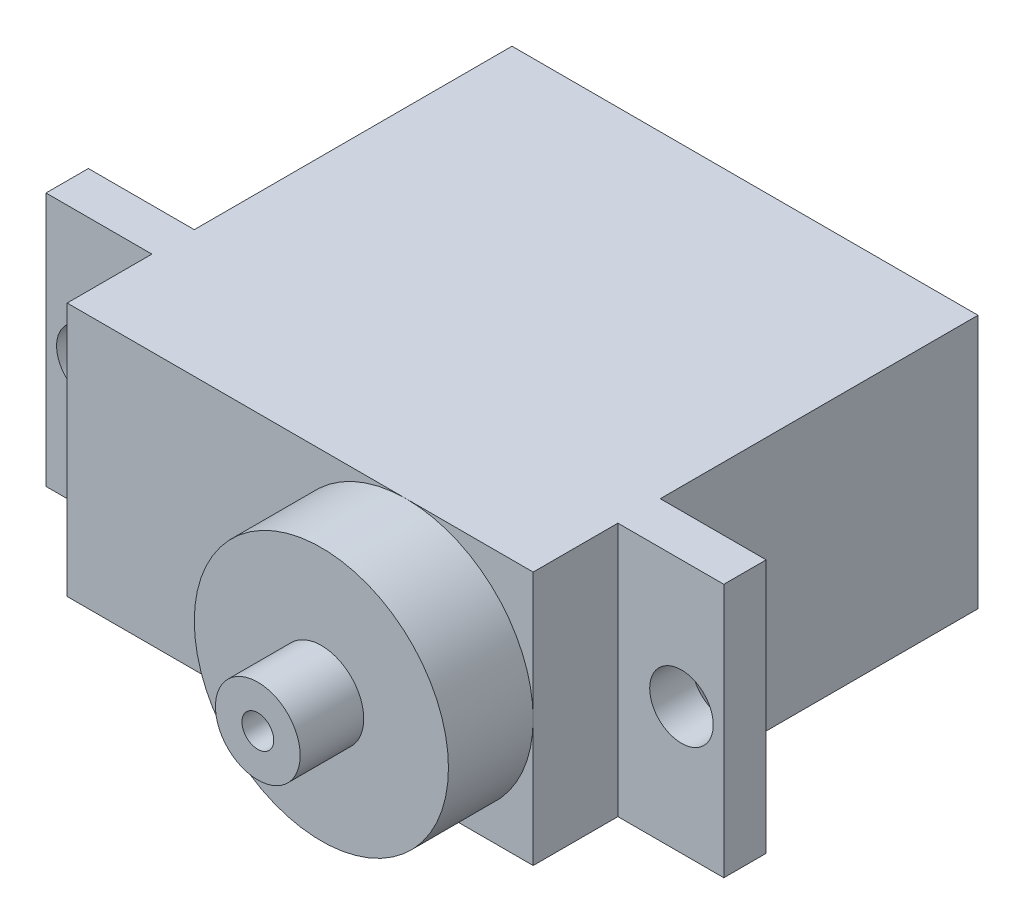
ISO-10303-21;
HEADER;
FILE_DESCRIPTION(('STEP AP214'),'2;1');
FILE_NAME('part.step','',(''),(''),'','','');
FILE_SCHEMA(('AUTOMOTIVE_DESIGN { 1 0 10303 214 1 1 1 1 }'));
ENDSEC;
DATA;
#1=APPLICATION_CONTEXT('core data for automotive mechanical design processes');
#2=APPLICATION_PROTOCOL_DEFINITION('international standard','automotive_design',2000,#1);
#3=PRODUCT_CONTEXT('',#1,'mechanical');
#4=PRODUCT('Part','Part','',(#3));
#5=PRODUCT_RELATED_PRODUCT_CATEGORY('part','',(#4));
#6=PRODUCT_DEFINITION_FORMATION('','',#4);
#7=PRODUCT_DEFINITION_CONTEXT('part definition',#1,'design');
#8=PRODUCT_DEFINITION('design','',#6,#7);
#9=PRODUCT_DEFINITION_SHAPE('','',#8);
#10=(LENGTH_UNIT() NAMED_UNIT(*) SI_UNIT(.MILLI.,.METRE.));
#11=(NAMED_UNIT(*) PLANE_ANGLE_UNIT() SI_UNIT($,.RADIAN.));
#12=(NAMED_UNIT(*) SI_UNIT($,.STERADIAN.) SOLID_ANGLE_UNIT());
#13=UNCERTAINTY_MEASURE_WITH_UNIT(LENGTH_MEASURE(1.E-05),#10,'distance_accuracy_value','');
#14=(GEOMETRIC_REPRESENTATION_CONTEXT(3) GLOBAL_UNCERTAINTY_ASSIGNED_CONTEXT((#13)) GLOBAL_UNIT_ASSIGNED_CONTEXT((#10,
#11,#12)) REPRESENTATION_CONTEXT('',''));
#15=CARTESIAN_POINT('',(0.,0.,0.));
#16=DIRECTION('',(0.,0.,1.));
#17=DIRECTION('',(1.,0.,0.));
#18=AXIS2_PLACEMENT_3D('',#15,#16,#17);
#19=CARTESIAN_POINT('',(0.,0.,21.));
#20=DIRECTION('',(0.,0.,1.));
#21=DIRECTION('',(1.,0.,0.));
#22=AXIS2_PLACEMENT_3D('',#19,#20,#21);
#23=PLANE('',#22);
#24=CARTESIAN_POINT('',(4.99999999999999,0.,21.));
#25=DIRECTION('',(0.,0.,1.));
#26=DIRECTION('',(1.,0.,0.));
#27=AXIS2_PLACEMENT_3D('',#24,#25,#26);
#28=CIRCLE('',#27,6.);
#29=CARTESIAN_POINT('',(11.,0.,21.));
#30=VERTEX_POINT('',#29);
#31=CARTESIAN_POINT('',(4.99999999999999,6.,21.));
#32=VERTEX_POINT('',#31);
#33=EDGE_CURVE('E46',#30,#32,#28,.T.);
#34=ORIENTED_EDGE('',*,*,#33,.F.);
#35=DIRECTION('',(0.,1.,0.));
#36=VECTOR('',#35,1.);
#37=CARTESIAN_POINT('',(11.,6.,21.));
#38=LINE('',#37,#36);
#39=CARTESIAN_POINT('',(11.,6.,21.));
#40=VERTEX_POINT('',#39);
#41=EDGE_CURVE('E140',#30,#40,#38,.T.);
#42=ORIENTED_EDGE('',*,*,#41,.T.);
#43=DIRECTION('',(-1.,0.,0.));
#44=VECTOR('',#43,1.);
#45=CARTESIAN_POINT('',(-11.,6.,21.));
#46=LINE('',#45,#44);
#47=EDGE_CURVE('E153',#40,#32,#46,.T.);
#48=ORIENTED_EDGE('',*,*,#47,.T.);
#49=EDGE_LOOP('',(#34,#42,#48));
#50=FACE_BOUND('',#49,.T.);
#51=ADVANCED_FACE('F35',(#50),#23,.T.);
#52=CARTESIAN_POINT('',(4.99999999999999,-6.,21.));
#53=VERTEX_POINT('',#52);
#54=EDGE_CURVE('E11',#32,#53,#28,.T.);
#55=ORIENTED_EDGE('',*,*,#54,.F.);
#56=CARTESIAN_POINT('',(-11.,6.,21.));
#57=VERTEX_POINT('',#56);
#58=EDGE_CURVE('E139',#32,#57,#46,.T.);
#59=ORIENTED_EDGE('',*,*,#58,.T.);
#60=DIRECTION('',(0.,-1.,0.));
#61=VECTOR('',#60,1.);
#62=CARTESIAN_POINT('',(-11.,6.,21.));
#63=LINE('',#62,#61);
#64=CARTESIAN_POINT('',(-11.,-6.,21.));
#65=VERTEX_POINT('',#64);
#66=EDGE_CURVE('E163',#57,#65,#63,.T.);
#67=ORIENTED_EDGE('',*,*,#66,.T.);
#68=DIRECTION('',(1.,0.,0.));
#69=VECTOR('',#68,1.);
#70=CARTESIAN_POINT('',(-11.,-6.,21.));
#71=LINE('',#70,#69);
#72=EDGE_CURVE('E151',#65,#53,#71,.T.);
#73=ORIENTED_EDGE('',*,*,#72,.T.);
#74=EDGE_LOOP('',(#55,#59,#67,#73));
#75=FACE_BOUND('',#74,.T.);
#76=ADVANCED_FACE('F283',(#75),#23,.T.);
#77=CARTESIAN_POINT('',(0.,0.,17.));
#78=DIRECTION('',(0.,0.,1.));
#79=DIRECTION('',(1.,0.,0.));
#80=AXIS2_PLACEMENT_3D('',#77,#78,#79);
#81=PLANE('',#80);
#82=CARTESIAN_POINT('',(-14.,0.,17.));
#83=DIRECTION('',(0.,0.,1.));
#84=DIRECTION('',(1.,0.,0.));
#85=AXIS2_PLACEMENT_3D('',#82,#83,#84);
#86=CIRCLE('',#85,1.5);
#87=CARTESIAN_POINT('',(-12.5,0.,17.));
#88=VERTEX_POINT('',#87);
#89=EDGE_CURVE('E535',#88,#88,#86,.T.);
#90=ORIENTED_EDGE('',*,*,#89,.F.);
#91=EDGE_LOOP('',(#90));
#92=FACE_BOUND('',#91,.T.);
#93=DIRECTION('',(0.,-1.,0.));
#94=VECTOR('',#93,1.);
#95=CARTESIAN_POINT('',(-11.,6.,17.));
#96=LINE('',#95,#94);
#97=CARTESIAN_POINT('',(-11.,6.,17.));
#98=VERTEX_POINT('',#97);
#99=CARTESIAN_POINT('',(-11.,-6.,17.));
#100=VERTEX_POINT('',#99);
#101=EDGE_CURVE('E170',#98,#100,#96,.T.);
#102=ORIENTED_EDGE('',*,*,#101,.F.);
#103=DIRECTION('',(-1.,0.,0.));
#104=VECTOR('',#103,1.);
#105=CARTESIAN_POINT('',(-16.,6.,17.));
#106=LINE('',#105,#104);
#107=CARTESIAN_POINT('',(-16.,6.,17.));
#108=VERTEX_POINT('',#107);
#109=EDGE_CURVE('E189',#98,#108,#106,.T.);
#110=ORIENTED_EDGE('',*,*,#109,.T.);
#111=DIRECTION('',(0.,-1.,0.));
#112=VECTOR('',#111,1.);
#113=CARTESIAN_POINT('',(-16.,6.,17.));
#114=LINE('',#113,#112);
#115=CARTESIAN_POINT('',(-16.,-6.,17.));
#116=VERTEX_POINT('',#115);
#117=EDGE_CURVE('E182',#108,#116,#114,.T.);
#118=ORIENTED_EDGE('',*,*,#117,.T.);
#119=DIRECTION('',(1.,0.,0.));
#120=VECTOR('',#119,1.);
#121=CARTESIAN_POINT('',(-16.,-6.,17.));
#122=LINE('',#121,#120);
#123=EDGE_CURVE('E185',#116,#100,#122,.T.);
#124=ORIENTED_EDGE('',*,*,#123,.T.);
#125=EDGE_LOOP('',(#102,#110,#118,#124));
#126=FACE_BOUND('',#125,.T.);
#127=ADVANCED_FACE('F288',(#92,#126),#81,.T.);
#128=CARTESIAN_POINT('',(16.,6.,30.));
#129=DIRECTION('',(-1.,0.,0.));
#130=DIRECTION('',(0.,-1.,0.));
#131=AXIS2_PLACEMENT_3D('',#128,#129,#130);
#132=PLANE('',#131);
#133=DIRECTION('',(0.,1.,0.));
#134=VECTOR('',#133,1.);
#135=CARTESIAN_POINT('',(16.,6.,17.));
#136=LINE('',#135,#134);
#137=CARTESIAN_POINT('',(16.,-6.,17.));
#138=VERTEX_POINT('',#137);
#139=CARTESIAN_POINT('',(16.,6.,17.));
#140=VERTEX_POINT('',#139);
#141=EDGE_CURVE('E187',#138,#140,#136,.T.);
#142=ORIENTED_EDGE('',*,*,#141,.F.);
#143=DIRECTION('',(0.,0.,-1.));
#144=VECTOR('',#143,1.);
#145=CARTESIAN_POINT('',(16.,-6.,30.));
#146=LINE('',#145,#144);
#147=CARTESIAN_POINT('',(16.,-6.,15.));
#148=VERTEX_POINT('',#147);
#149=EDGE_CURVE('E236',#138,#148,#146,.T.);
#150=ORIENTED_EDGE('',*,*,#149,.T.);
#151=DIRECTION('',(0.,-1.,0.));
#152=VECTOR('',#151,1.);
#153=CARTESIAN_POINT('',(16.,6.,15.));
#154=LINE('',#153,#152);
#155=CARTESIAN_POINT('',(16.,6.,15.));
#156=VERTEX_POINT('',#155);
#157=EDGE_CURVE('E212',#156,#148,#154,.T.);
#158=ORIENTED_EDGE('',*,*,#157,.F.);
#159=DIRECTION('',(0.,0.,-1.));
#160=VECTOR('',#159,1.);
#161=CARTESIAN_POINT('',(16.,6.,30.));
#162=LINE('',#161,#160);
#163=EDGE_CURVE('E158',#140,#156,#162,.T.);
#164=ORIENTED_EDGE('',*,*,#163,.F.);
#165=EDGE_LOOP('',(#142,#150,#158,#164));
#166=FACE_BOUND('',#165,.T.);
#167=ADVANCED_FACE('F37',(#166),#132,.F.);
#168=CARTESIAN_POINT('',(-16.,6.,30.));
#169=DIRECTION('',(0.,-1.,0.));
#170=DIRECTION('',(0.,0.,-1.));
#171=AXIS2_PLACEMENT_3D('',#168,#169,#170);
#172=PLANE('',#171);
#173=CARTESIAN_POINT('',(11.,6.,17.));
#174=VERTEX_POINT('',#173);
#175=EDGE_CURVE('E190',#140,#174,#106,.T.);
#176=ORIENTED_EDGE('',*,*,#175,.F.);
#177=ORIENTED_EDGE('',*,*,#163,.T.);
#178=DIRECTION('',(1.,0.,0.));
#179=VECTOR('',#178,1.);
#180=CARTESIAN_POINT('',(16.,6.,15.));
#181=LINE('',#180,#179);
#182=CARTESIAN_POINT('',(11.,6.,15.));
#183=VERTEX_POINT('',#182);
#184=EDGE_CURVE('E221',#183,#156,#181,.T.);
#185=ORIENTED_EDGE('',*,*,#184,.F.);
#186=DIRECTION('',(0.,0.,-1.));
#187=VECTOR('',#186,1.);
#188=CARTESIAN_POINT('',(11.,6.,15.));
#189=LINE('',#188,#187);
#190=CARTESIAN_POINT('',(11.,6.,0.));
#191=VERTEX_POINT('',#190);
#192=EDGE_CURVE('E226',#183,#191,#189,.T.);
#193=ORIENTED_EDGE('',*,*,#192,.T.);
#194=DIRECTION('',(-1.,0.,0.));
#195=VECTOR('',#194,1.);
#196=CARTESIAN_POINT('',(-16.,6.,0.));
#197=LINE('',#196,#195);
#198=CARTESIAN_POINT('',(-11.,6.,0.));
#199=VERTEX_POINT('',#198);
#200=EDGE_CURVE('E229',#191,#199,#197,.T.);
#201=ORIENTED_EDGE('',*,*,#200,.T.);
#202=DIRECTION('',(0.,0.,-1.));
#203=VECTOR('',#202,1.);
#204=CARTESIAN_POINT('',(-11.,6.,15.));
#205=LINE('',#204,#203);
#206=CARTESIAN_POINT('',(-11.,6.,15.));
#207=VERTEX_POINT('',#206);
#208=EDGE_CURVE('E205',#207,#199,#205,.T.);
#209=ORIENTED_EDGE('',*,*,#208,.F.);
#210=DIRECTION('',(1.,0.,0.));
#211=VECTOR('',#210,1.);
#212=CARTESIAN_POINT('',(-16.,6.,15.));
#213=LINE('',#212,#211);
#214=CARTESIAN_POINT('',(-16.,6.,15.));
#215=VERTEX_POINT('',#214);
#216=EDGE_CURVE('E196',#215,#207,#213,.T.);
#217=ORIENTED_EDGE('',*,*,#216,.F.);
#218=DIRECTION('',(0.,0.,-1.));
#219=VECTOR('',#218,1.);
#220=CARTESIAN_POINT('',(-16.,6.,30.));
#221=LINE('',#220,#219);
#222=EDGE_CURVE('E159',#108,#215,#221,.T.);
#223=ORIENTED_EDGE('',*,*,#222,.F.);
#224=ORIENTED_EDGE('',*,*,#109,.F.);
#225=DIRECTION('',(0.,0.,-1.));
#226=VECTOR('',#225,1.);
#227=CARTESIAN_POINT('',(-11.,6.,21.));
#228=LINE('',#227,#226);
#229=EDGE_CURVE('E169',#57,#98,#228,.T.);
#230=ORIENTED_EDGE('',*,*,#229,.F.);
#231=ORIENTED_EDGE('',*,*,#58,.F.);
#232=ORIENTED_EDGE('',*,*,#47,.F.);
#233=DIRECTION('',(0.,0.,-1.));
#234=VECTOR('',#233,1.);
#235=CARTESIAN_POINT('',(11.,6.,21.));
#236=LINE('',#235,#234);
#237=EDGE_CURVE('E147',#40,#174,#236,.T.);
#238=ORIENTED_EDGE('',*,*,#237,.T.);
#239=EDGE_LOOP('',(#176,#177,#185,#193,#201,#209,#217,#223,#224,#230,#231,#232,#238));
#240=FACE_BOUND('',#239,.T.);
#241=ADVANCED_FACE('F254',(#240),#172,.F.);
#242=CARTESIAN_POINT('',(-16.,6.,30.));
#243=DIRECTION('',(1.,0.,0.));
#244=DIRECTION('',(0.,1.,0.));
#245=AXIS2_PLACEMENT_3D('',#242,#243,#244);
#246=PLANE('',#245);
#247=ORIENTED_EDGE('',*,*,#117,.F.);
#248=ORIENTED_EDGE('',*,*,#222,.T.);
#249=DIRECTION('',(0.,1.,0.));
#250=VECTOR('',#249,1.);
#251=CARTESIAN_POINT('',(-16.,6.,15.));
#252=LINE('',#251,#250);
#253=CARTESIAN_POINT('',(-16.,-6.,15.));
#254=VERTEX_POINT('',#253);
#255=EDGE_CURVE('E193',#254,#215,#252,.T.);
#256=ORIENTED_EDGE('',*,*,#255,.F.);
#257=DIRECTION('',(0.,0.,-1.));
#258=VECTOR('',#257,1.);
#259=CARTESIAN_POINT('',(-16.,-6.,30.));
#260=LINE('',#259,#258);
#261=EDGE_CURVE('E238',#116,#254,#260,.T.);
#262=ORIENTED_EDGE('',*,*,#261,.F.);
#263=EDGE_LOOP('',(#247,#248,#256,#262));
#264=FACE_BOUND('',#263,.T.);
#265=ADVANCED_FACE('F244',(#264),#246,.F.);
#266=CARTESIAN_POINT('',(-16.,-6.,30.));
#267=DIRECTION('',(0.,1.,0.));
#268=DIRECTION('',(0.,0.,1.));
#269=AXIS2_PLACEMENT_3D('',#266,#267,#268);
#270=PLANE('',#269);
#271=ORIENTED_EDGE('',*,*,#123,.F.);
#272=ORIENTED_EDGE('',*,*,#261,.T.);
#273=DIRECTION('',(-1.,0.,0.));
#274=VECTOR('',#273,1.);
#275=CARTESIAN_POINT('',(-16.,-6.,15.));
#276=LINE('',#275,#274);
#277=CARTESIAN_POINT('',(-11.,-6.,15.));
#278=VERTEX_POINT('',#277);
#279=EDGE_CURVE('E202',#278,#254,#276,.T.);
#280=ORIENTED_EDGE('',*,*,#279,.F.);
#281=DIRECTION('',(0.,0.,-1.));
#282=VECTOR('',#281,1.);
#283=CARTESIAN_POINT('',(-11.,-6.,15.));
#284=LINE('',#283,#282);
#285=CARTESIAN_POINT('',(-11.,-6.,0.));
#286=VERTEX_POINT('',#285);
#287=EDGE_CURVE('E207',#278,#286,#284,.T.);
#288=ORIENTED_EDGE('',*,*,#287,.T.);
#289=DIRECTION('',(1.,0.,0.));
#290=VECTOR('',#289,1.);
#291=CARTESIAN_POINT('',(-16.,-6.,0.));
#292=LINE('',#291,#290);
#293=CARTESIAN_POINT('',(11.,-6.,0.));
#294=VERTEX_POINT('',#293);
#295=EDGE_CURVE('E234',#286,#294,#292,.T.);
#296=ORIENTED_EDGE('',*,*,#295,.T.);
#297=DIRECTION('',(0.,0.,-1.));
#298=VECTOR('',#297,1.);
#299=CARTESIAN_POINT('',(11.,-6.,15.));
#300=LINE('',#299,#298);
#301=CARTESIAN_POINT('',(11.,-6.,15.));
#302=VERTEX_POINT('',#301);
#303=EDGE_CURVE('E224',#302,#294,#300,.T.);
#304=ORIENTED_EDGE('',*,*,#303,.F.);
#305=DIRECTION('',(-1.,0.,0.));
#306=VECTOR('',#305,1.);
#307=CARTESIAN_POINT('',(16.,-6.,15.));
#308=LINE('',#307,#306);
#309=EDGE_CURVE('E215',#148,#302,#308,.T.);
#310=ORIENTED_EDGE('',*,*,#309,.F.);
#311=ORIENTED_EDGE('',*,*,#149,.F.);
#312=CARTESIAN_POINT('',(11.,-6.,17.));
#313=VERTEX_POINT('',#312);
#314=EDGE_CURVE('E184',#313,#138,#122,.T.);
#315=ORIENTED_EDGE('',*,*,#314,.F.);
#316=DIRECTION('',(0.,0.,-1.));
#317=VECTOR('',#316,1.);
#318=CARTESIAN_POINT('',(11.,-6.,21.));
#319=LINE('',#318,#317);
#320=CARTESIAN_POINT('',(11.,-6.,21.));
#321=VERTEX_POINT('',#320);
#322=EDGE_CURVE('E177',#321,#313,#319,.T.);
#323=ORIENTED_EDGE('',*,*,#322,.F.);
#324=EDGE_CURVE('E135',#53,#321,#71,.T.);
#325=ORIENTED_EDGE('',*,*,#324,.F.);
#326=ORIENTED_EDGE('',*,*,#72,.F.);
#327=DIRECTION('',(0.,0.,-1.));
#328=VECTOR('',#327,1.);
#329=CARTESIAN_POINT('',(-11.,-6.,21.));
#330=LINE('',#329,#328);
#331=EDGE_CURVE('E179',#65,#100,#330,.T.);
#332=ORIENTED_EDGE('',*,*,#331,.T.);
#333=EDGE_LOOP('',(#271,#272,#280,#288,#296,#304,#310,#311,#315,#323,#325,#326,#332));
#334=FACE_BOUND('',#333,.T.);
#335=ADVANCED_FACE('F266',(#334),#270,.F.);
#336=CARTESIAN_POINT('',(0.,0.,0.));
#337=DIRECTION('',(0.,0.,1.));
#338=DIRECTION('',(1.,0.,0.));
#339=AXIS2_PLACEMENT_3D('',#336,#337,#338);
#340=PLANE('',#339);
#341=ORIENTED_EDGE('',*,*,#295,.F.);
#342=DIRECTION('',(0.,-1.,0.));
#343=VECTOR('',#342,1.);
#344=CARTESIAN_POINT('',(-11.,6.,0.));
#345=LINE('',#344,#343);
#346=EDGE_CURVE('E192',#199,#286,#345,.T.);
#347=ORIENTED_EDGE('',*,*,#346,.F.);
#348=ORIENTED_EDGE('',*,*,#200,.F.);
#349=DIRECTION('',(0.,1.,0.));
#350=VECTOR('',#349,1.);
#351=CARTESIAN_POINT('',(11.,6.,0.));
#352=LINE('',#351,#350);
#353=EDGE_CURVE('E210',#294,#191,#352,.T.);
#354=ORIENTED_EDGE('',*,*,#353,.F.);
#355=EDGE_LOOP('',(#341,#347,#348,#354));
#356=FACE_BOUND('',#355,.T.);
#357=ADVANCED_FACE('F261',(#356),#340,.F.);
#358=CARTESIAN_POINT('',(11.,6.,15.));
#359=DIRECTION('',(-1.,0.,0.));
#360=DIRECTION('',(0.,0.,1.));
#361=AXIS2_PLACEMENT_3D('',#358,#359,#360);
#362=PLANE('',#361);
#363=ORIENTED_EDGE('',*,*,#353,.T.);
#364=ORIENTED_EDGE('',*,*,#192,.F.);
#365=DIRECTION('',(0.,1.,0.));
#366=VECTOR('',#365,1.);
#367=CARTESIAN_POINT('',(11.,6.,15.));
#368=LINE('',#367,#366);
#369=EDGE_CURVE('E218',#302,#183,#368,.T.);
#370=ORIENTED_EDGE('',*,*,#369,.F.);
#371=ORIENTED_EDGE('',*,*,#303,.T.);
#372=EDGE_LOOP('',(#363,#364,#370,#371));
#373=FACE_BOUND('',#372,.T.);
#374=ADVANCED_FACE('F269',(#373),#362,.F.);
#375=CARTESIAN_POINT('',(0.,0.,15.));
#376=DIRECTION('',(0.,0.,-1.));
#377=DIRECTION('',(-1.,0.,0.));
#378=AXIS2_PLACEMENT_3D('',#375,#376,#377);
#379=PLANE('',#378);
#380=CARTESIAN_POINT('',(14.,0.,15.));
#381=DIRECTION('',(0.,0.,-1.));
#382=DIRECTION('',(-1.,0.,0.));
#383=AXIS2_PLACEMENT_3D('',#380,#381,#382);
#384=CIRCLE('',#383,1.5);
#385=CARTESIAN_POINT('',(12.5,0.,15.));
#386=VERTEX_POINT('',#385);
#387=EDGE_CURVE('E530',#386,#386,#384,.F.);
#388=ORIENTED_EDGE('',*,*,#387,.T.);
#389=EDGE_LOOP('',(#388));
#390=FACE_BOUND('',#389,.T.);
#391=ORIENTED_EDGE('',*,*,#157,.T.);
#392=ORIENTED_EDGE('',*,*,#309,.T.);
#393=ORIENTED_EDGE('',*,*,#369,.T.);
#394=ORIENTED_EDGE('',*,*,#184,.T.);
#395=EDGE_LOOP('',(#391,#392,#393,#394));
#396=FACE_BOUND('',#395,.T.);
#397=ADVANCED_FACE('F272',(#390,#396),#379,.T.);
#398=CARTESIAN_POINT('',(-11.,6.,15.));
#399=DIRECTION('',(1.,0.,0.));
#400=DIRECTION('',(0.,1.,0.));
#401=AXIS2_PLACEMENT_3D('',#398,#399,#400);
#402=PLANE('',#401);
#403=ORIENTED_EDGE('',*,*,#346,.T.);
#404=ORIENTED_EDGE('',*,*,#287,.F.);
#405=DIRECTION('',(0.,-1.,0.));
#406=VECTOR('',#405,1.);
#407=CARTESIAN_POINT('',(-11.,6.,15.));
#408=LINE('',#407,#406);
#409=EDGE_CURVE('E199',#207,#278,#408,.T.);
#410=ORIENTED_EDGE('',*,*,#409,.F.);
#411=ORIENTED_EDGE('',*,*,#208,.T.);
#412=EDGE_LOOP('',(#403,#404,#410,#411));
#413=FACE_BOUND('',#412,.T.);
#414=ADVANCED_FACE('F258',(#413),#402,.F.);
#415=CARTESIAN_POINT('',(0.,0.,15.));
#416=DIRECTION('',(0.,0.,1.));
#417=DIRECTION('',(1.,0.,0.));
#418=AXIS2_PLACEMENT_3D('',#415,#416,#417);
#419=PLANE('',#418);
#420=CARTESIAN_POINT('',(-14.,0.,15.));
#421=DIRECTION('',(0.,0.,1.));
#422=DIRECTION('',(1.,0.,0.));
#423=AXIS2_PLACEMENT_3D('',#420,#421,#422);
#424=CIRCLE('',#423,1.5);
#425=CARTESIAN_POINT('',(-12.5,0.,15.));
#426=VERTEX_POINT('',#425);
#427=EDGE_CURVE('E39',#426,#426,#424,.T.);
#428=ORIENTED_EDGE('',*,*,#427,.T.);
#429=EDGE_LOOP('',(#428));
#430=FACE_BOUND('',#429,.T.);
#431=ORIENTED_EDGE('',*,*,#255,.T.);
#432=ORIENTED_EDGE('',*,*,#216,.T.);
#433=ORIENTED_EDGE('',*,*,#409,.T.);
#434=ORIENTED_EDGE('',*,*,#279,.T.);
#435=EDGE_LOOP('',(#431,#432,#433,#434));
#436=FACE_BOUND('',#435,.T.);
#437=ADVANCED_FACE('F250',(#430,#436),#419,.F.);
#438=CARTESIAN_POINT('',(14.,0.,17.));
#439=DIRECTION('',(0.,0.,-1.));
#440=DIRECTION('',(-1.,0.,0.));
#441=AXIS2_PLACEMENT_3D('',#438,#439,#440);
#442=CIRCLE('',#441,1.5);
#443=CARTESIAN_POINT('',(12.5,0.,17.));
#444=VERTEX_POINT('',#443);
#445=EDGE_CURVE('E533',#444,#444,#442,.T.);
#446=ORIENTED_EDGE('',*,*,#445,.T.);
#447=EDGE_LOOP('',(#446));
#448=FACE_BOUND('',#447,.T.);
#449=DIRECTION('',(0.,1.,0.));
#450=VECTOR('',#449,1.);
#451=CARTESIAN_POINT('',(11.,6.,17.));
#452=LINE('',#451,#450);
#453=EDGE_CURVE('E166',#313,#174,#452,.T.);
#454=ORIENTED_EDGE('',*,*,#453,.F.);
#455=ORIENTED_EDGE('',*,*,#314,.T.);
#456=ORIENTED_EDGE('',*,*,#141,.T.);
#457=ORIENTED_EDGE('',*,*,#175,.T.);
#458=EDGE_LOOP('',(#454,#455,#456,#457));
#459=FACE_BOUND('',#458,.T.);
#460=ADVANCED_FACE('F280',(#448,#459),#81,.T.);
#461=CARTESIAN_POINT('',(-11.,6.,21.));
#462=DIRECTION('',(1.,0.,0.));
#463=DIRECTION('',(0.,1.,0.));
#464=AXIS2_PLACEMENT_3D('',#461,#462,#463);
#465=PLANE('',#464);
#466=ORIENTED_EDGE('',*,*,#101,.T.);
#467=ORIENTED_EDGE('',*,*,#331,.F.);
#468=ORIENTED_EDGE('',*,*,#66,.F.);
#469=ORIENTED_EDGE('',*,*,#229,.T.);
#470=EDGE_LOOP('',(#466,#467,#468,#469));
#471=FACE_BOUND('',#470,.T.);
#472=ADVANCED_FACE('F286',(#471),#465,.F.);
#473=CARTESIAN_POINT('',(11.,6.,21.));
#474=DIRECTION('',(-1.,0.,0.));
#475=DIRECTION('',(0.,0.,1.));
#476=AXIS2_PLACEMENT_3D('',#473,#474,#475);
#477=PLANE('',#476);
#478=ORIENTED_EDGE('',*,*,#453,.T.);
#479=ORIENTED_EDGE('',*,*,#237,.F.);
#480=ORIENTED_EDGE('',*,*,#41,.F.);
#481=EDGE_CURVE('E132',#321,#30,#38,.T.);
#482=ORIENTED_EDGE('',*,*,#481,.F.);
#483=ORIENTED_EDGE('',*,*,#322,.T.);
#484=EDGE_LOOP('',(#478,#479,#480,#482,#483));
#485=FACE_BOUND('',#484,.T.);
#486=ADVANCED_FACE('F145',(#485),#477,.F.);
#487=EDGE_CURVE('E44',#53,#30,#28,.T.);
#488=ORIENTED_EDGE('',*,*,#487,.F.);
#489=ORIENTED_EDGE('',*,*,#324,.T.);
#490=ORIENTED_EDGE('',*,*,#481,.T.);
#491=EDGE_LOOP('',(#488,#489,#490));
#492=FACE_BOUND('',#491,.T.);
#493=ADVANCED_FACE('F134',(#492),#23,.T.);
#494=CARTESIAN_POINT('',(4.99999999999999,0.,25.));
#495=DIRECTION('',(0.,0.,-1.));
#496=DIRECTION('',(-1.,0.,0.));
#497=AXIS2_PLACEMENT_3D('',#494,#495,#496);
#498=CYLINDRICAL_SURFACE('',#497,6.);
#499=CARTESIAN_POINT('',(4.99999999999999,0.,25.));
#500=DIRECTION('',(0.,0.,1.));
#501=DIRECTION('',(1.,0.,0.));
#502=AXIS2_PLACEMENT_3D('',#499,#500,#501);
#503=CIRCLE('',#502,6.);
#504=CARTESIAN_POINT('',(11.,0.,25.));
#505=VERTEX_POINT('',#504);
#506=EDGE_CURVE('E155',#505,#505,#503,.T.);
#507=ORIENTED_EDGE('',*,*,#506,.F.);
#508=EDGE_LOOP('',(#507));
#509=FACE_BOUND('',#508,.T.);
#510=ORIENTED_EDGE('',*,*,#33,.T.);
#511=ORIENTED_EDGE('',*,*,#54,.T.);
#512=ORIENTED_EDGE('',*,*,#487,.T.);
#513=EDGE_LOOP('',(#510,#511,#512));
#514=FACE_BOUND('',#513,.T.);
#515=ADVANCED_FACE('F157',(#509,#514),#498,.T.);
#516=CARTESIAN_POINT('',(4.99999999999999,0.,25.));
#517=DIRECTION('',(0.,0.,1.));
#518=DIRECTION('',(1.,0.,0.));
#519=AXIS2_PLACEMENT_3D('',#516,#517,#518);
#520=PLANE('',#519);
#521=CARTESIAN_POINT('',(4.99999999999999,0.,25.));
#522=DIRECTION('',(0.,0.,1.));
#523=DIRECTION('',(1.,0.,0.));
#524=AXIS2_PLACEMENT_3D('',#521,#522,#523);
#525=CIRCLE('',#524,2.);
#526=CARTESIAN_POINT('',(6.99999999999999,0.,25.));
#527=VERTEX_POINT('',#526);
#528=EDGE_CURVE('E543',#527,#527,#525,.T.);
#529=ORIENTED_EDGE('',*,*,#528,.F.);
#530=EDGE_LOOP('',(#529));
#531=FACE_BOUND('',#530,.T.);
#532=ORIENTED_EDGE('',*,*,#506,.T.);
#533=EDGE_LOOP('',(#532));
#534=FACE_BOUND('',#533,.T.);
#535=ADVANCED_FACE('F312',(#531,#534),#520,.T.);
#536=CARTESIAN_POINT('',(4.99999999999999,0.,28.));
#537=DIRECTION('',(0.,0.,-1.));
#538=DIRECTION('',(-1.,0.,0.));
#539=AXIS2_PLACEMENT_3D('',#536,#537,#538);
#540=CYLINDRICAL_SURFACE('',#539,2.);
#541=CARTESIAN_POINT('',(4.99999999999999,0.,28.));
#542=DIRECTION('',(0.,0.,1.));
#543=DIRECTION('',(1.,0.,0.));
#544=AXIS2_PLACEMENT_3D('',#541,#542,#543);
#545=CIRCLE('',#544,2.);
#546=CARTESIAN_POINT('',(6.99999999999999,0.,28.));
#547=VERTEX_POINT('',#546);
#548=EDGE_CURVE('E156',#547,#547,#545,.T.);
#549=ORIENTED_EDGE('',*,*,#548,.F.);
#550=EDGE_LOOP('',(#549));
#551=FACE_BOUND('',#550,.T.);
#552=ORIENTED_EDGE('',*,*,#528,.T.);
#553=EDGE_LOOP('',(#552));
#554=FACE_BOUND('',#553,.T.);
#555=ADVANCED_FACE('F439',(#551,#554),#540,.T.);
#556=CARTESIAN_POINT('',(4.99999999999999,0.,28.));
#557=DIRECTION('',(0.,0.,1.));
#558=DIRECTION('',(1.,0.,0.));
#559=AXIS2_PLACEMENT_3D('',#556,#557,#558);
#560=PLANE('',#559);
#561=CARTESIAN_POINT('',(4.99999999999999,0.,28.));
#562=DIRECTION('',(0.,0.,1.));
#563=DIRECTION('',(1.,0.,0.));
#564=AXIS2_PLACEMENT_3D('',#561,#562,#563);
#565=CIRCLE('',#564,0.75);
#566=CARTESIAN_POINT('',(5.74999999999999,0.,28.));
#567=VERTEX_POINT('',#566);
#568=EDGE_CURVE('E544',#567,#567,#565,.T.);
#569=ORIENTED_EDGE('',*,*,#568,.F.);
#570=EDGE_LOOP('',(#569));
#571=FACE_BOUND('',#570,.T.);
#572=ORIENTED_EDGE('',*,*,#548,.T.);
#573=EDGE_LOOP('',(#572));
#574=FACE_BOUND('',#573,.T.);
#575=ADVANCED_FACE('F450',(#571,#574),#560,.T.);
#576=CARTESIAN_POINT('',(4.99999999999999,0.,24.));
#577=DIRECTION('',(0.,0.,1.));
#578=DIRECTION('',(1.,0.,0.));
#579=AXIS2_PLACEMENT_3D('',#576,#577,#578);
#580=CYLINDRICAL_SURFACE('',#579,0.75);
#581=CARTESIAN_POINT('',(4.99999999999999,0.,24.));
#582=DIRECTION('',(0.,0.,1.));
#583=DIRECTION('',(1.,0.,0.));
#584=AXIS2_PLACEMENT_3D('',#581,#582,#583);
#585=CIRCLE('',#584,0.75);
#586=CARTESIAN_POINT('',(5.74999999999999,0.,24.));
#587=VERTEX_POINT('',#586);
#588=EDGE_CURVE('E540',#587,#587,#585,.T.);
#589=ORIENTED_EDGE('',*,*,#588,.F.);
#590=EDGE_LOOP('',(#589));
#591=FACE_BOUND('',#590,.T.);
#592=ORIENTED_EDGE('',*,*,#568,.T.);
#593=EDGE_LOOP('',(#592));
#594=FACE_BOUND('',#593,.T.);
#595=ADVANCED_FACE('F461',(#591,#594),#580,.F.);
#596=CARTESIAN_POINT('',(4.99999999999999,0.,24.));
#597=DIRECTION('',(0.,0.,1.));
#598=DIRECTION('',(1.,0.,0.));
#599=AXIS2_PLACEMENT_3D('',#596,#597,#598);
#600=PLANE('',#599);
#601=ORIENTED_EDGE('',*,*,#588,.T.);
#602=EDGE_LOOP('',(#601));
#603=FACE_BOUND('',#602,.T.);
#604=ADVANCED_FACE('F472',(#603),#600,.T.);
#605=CARTESIAN_POINT('',(-14.,0.,13.));
#606=DIRECTION('',(0.,0.,1.));
#607=DIRECTION('',(1.,0.,0.));
#608=AXIS2_PLACEMENT_3D('',#605,#606,#607);
#609=CYLINDRICAL_SURFACE('',#608,1.5);
#610=ORIENTED_EDGE('',*,*,#89,.T.);
#611=EDGE_LOOP('',(#610));
#612=FACE_BOUND('',#611,.T.);
#613=ORIENTED_EDGE('',*,*,#427,.F.);
#614=EDGE_LOOP('',(#613));
#615=FACE_BOUND('',#614,.T.);
#616=ADVANCED_FACE('F482',(#612,#615),#609,.F.);
#617=CARTESIAN_POINT('',(14.,0.,13.));
#618=DIRECTION('',(0.,0.,1.));
#619=DIRECTION('',(1.,0.,0.));
#620=AXIS2_PLACEMENT_3D('',#617,#618,#619);
#621=CYLINDRICAL_SURFACE('',#620,1.5);
#622=ORIENTED_EDGE('',*,*,#387,.F.);
#623=EDGE_LOOP('',(#622));
#624=FACE_BOUND('',#623,.T.);
#625=ORIENTED_EDGE('',*,*,#445,.F.);
#626=EDGE_LOOP('',(#625));
#627=FACE_BOUND('',#626,.T.);
#628=ADVANCED_FACE('F501',(#624,#627),#621,.F.);
#629=CLOSED_SHELL('',(#51,#76,#127,#167,#241,#265,#335,#357,#374,#397,#414,#437,#460,#472,#486,
#493,#515,#535,#555,#575,#595,#604,#616,#628));
#630=MANIFOLD_SOLID_BREP('B2',#629);
#631=ADVANCED_BREP_SHAPE_REPRESENTATION('',(#18,#630),#14);
#632=SHAPE_DEFINITION_REPRESENTATION(#9,#631);
ENDSEC;
END-ISO-10303-21;
